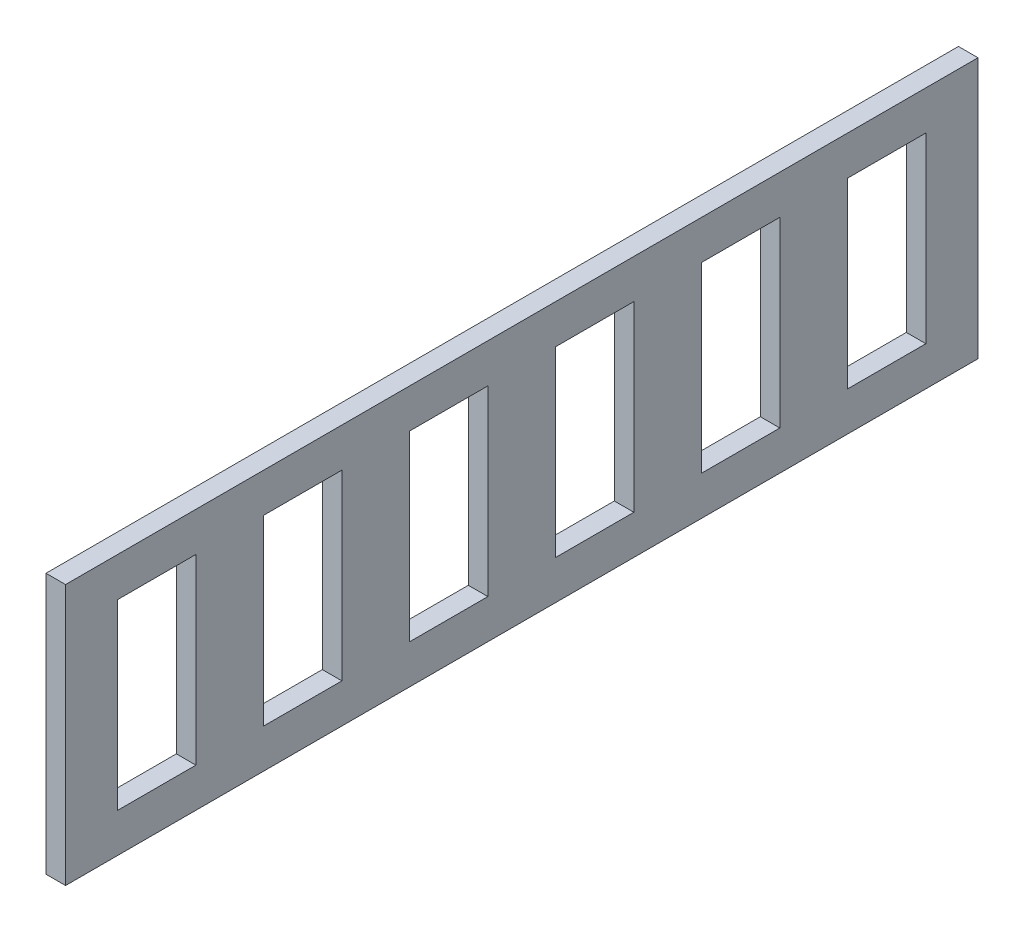
ISO-10303-21;
HEADER;
FILE_DESCRIPTION(('STEP AP214'),'2;1');
FILE_NAME('part.step','',(''),(''),'','','');
FILE_SCHEMA(('AUTOMOTIVE_DESIGN { 1 0 10303 214 1 1 1 1 }'));
ENDSEC;
DATA;
#1=APPLICATION_CONTEXT('core data for automotive mechanical design processes');
#2=APPLICATION_PROTOCOL_DEFINITION('international standard','automotive_design',2000,#1);
#3=PRODUCT_CONTEXT('',#1,'mechanical');
#4=PRODUCT('Part','Part','',(#3));
#5=PRODUCT_RELATED_PRODUCT_CATEGORY('part','',(#4));
#6=PRODUCT_DEFINITION_FORMATION('','',#4);
#7=PRODUCT_DEFINITION_CONTEXT('part definition',#1,'design');
#8=PRODUCT_DEFINITION('design','',#6,#7);
#9=PRODUCT_DEFINITION_SHAPE('','',#8);
#10=(LENGTH_UNIT() NAMED_UNIT(*) SI_UNIT(.MILLI.,.METRE.));
#11=(NAMED_UNIT(*) PLANE_ANGLE_UNIT() SI_UNIT($,.RADIAN.));
#12=(NAMED_UNIT(*) SI_UNIT($,.STERADIAN.) SOLID_ANGLE_UNIT());
#13=UNCERTAINTY_MEASURE_WITH_UNIT(LENGTH_MEASURE(1.E-05),#10,'distance_accuracy_value','');
#14=(GEOMETRIC_REPRESENTATION_CONTEXT(3) GLOBAL_UNCERTAINTY_ASSIGNED_CONTEXT((#13)) GLOBAL_UNIT_ASSIGNED_CONTEXT((#10,
#11,#12)) REPRESENTATION_CONTEXT('',''));
#15=CARTESIAN_POINT('',(0.,0.,0.));
#16=DIRECTION('',(0.,0.,1.));
#17=DIRECTION('',(1.,0.,0.));
#18=AXIS2_PLACEMENT_3D('',#15,#16,#17);
#19=CARTESIAN_POINT('',(15.,0.,0.));
#20=DIRECTION('',(-1.,0.,0.));
#21=DIRECTION('',(0.,0.,1.));
#22=AXIS2_PLACEMENT_3D('',#19,#20,#21);
#23=PLANE('',#22);
#24=DIRECTION('',(0.,0.,1.));
#25=VECTOR('',#24,1.);
#26=CARTESIAN_POINT('',(15.,170.,-138.));
#27=LINE('',#26,#25);
#28=CARTESIAN_POINT('',(15.,170.,-198.));
#29=VERTEX_POINT('',#28);
#30=CARTESIAN_POINT('',(15.,170.,-138.));
#31=VERTEX_POINT('',#30);
#32=EDGE_CURVE('E273',#29,#31,#27,.T.);
#33=ORIENTED_EDGE('',*,*,#32,.F.);
#34=DIRECTION('',(0.,1.,0.));
#35=VECTOR('',#34,1.);
#36=CARTESIAN_POINT('',(15.,170.,-198.));
#37=LINE('',#36,#35);
#38=CARTESIAN_POINT('',(15.,30.,-198.));
#39=VERTEX_POINT('',#38);
#40=EDGE_CURVE('E284',#39,#29,#37,.T.);
#41=ORIENTED_EDGE('',*,*,#40,.F.);
#42=DIRECTION('',(0.,0.,-1.));
#43=VECTOR('',#42,1.);
#44=CARTESIAN_POINT('',(15.,30.,-138.));
#45=LINE('',#44,#43);
#46=CARTESIAN_POINT('',(15.,30.,-138.));
#47=VERTEX_POINT('',#46);
#48=EDGE_CURVE('E280',#47,#39,#45,.T.);
#49=ORIENTED_EDGE('',*,*,#48,.F.);
#50=DIRECTION('',(0.,-1.,0.));
#51=VECTOR('',#50,1.);
#52=CARTESIAN_POINT('',(15.,170.,-138.));
#53=LINE('',#52,#51);
#54=EDGE_CURVE('E276',#31,#47,#53,.T.);
#55=ORIENTED_EDGE('',*,*,#54,.F.);
#56=EDGE_LOOP('',(#33,#41,#49,#55));
#57=FACE_BOUND('',#56,.T.);
#58=DIRECTION('',(0.,0.,1.));
#59=VECTOR('',#58,1.);
#60=CARTESIAN_POINT('',(15.,170.,86.));
#61=LINE('',#60,#59);
#62=CARTESIAN_POINT('',(15.,170.,26.));
#63=VERTEX_POINT('',#62);
#64=CARTESIAN_POINT('',(15.,170.,86.));
#65=VERTEX_POINT('',#64);
#66=EDGE_CURVE('E359',#63,#65,#61,.T.);
#67=ORIENTED_EDGE('',*,*,#66,.F.);
#68=DIRECTION('',(0.,1.,0.));
#69=VECTOR('',#68,1.);
#70=CARTESIAN_POINT('',(15.,170.,26.));
#71=LINE('',#70,#69);
#72=CARTESIAN_POINT('',(15.,30.,26.));
#73=VERTEX_POINT('',#72);
#74=EDGE_CURVE('E370',#73,#63,#71,.T.);
#75=ORIENTED_EDGE('',*,*,#74,.F.);
#76=DIRECTION('',(0.,0.,-1.));
#77=VECTOR('',#76,1.);
#78=CARTESIAN_POINT('',(15.,30.,86.));
#79=LINE('',#78,#77);
#80=CARTESIAN_POINT('',(15.,30.,86.));
#81=VERTEX_POINT('',#80);
#82=EDGE_CURVE('E366',#81,#73,#79,.T.);
#83=ORIENTED_EDGE('',*,*,#82,.F.);
#84=DIRECTION('',(0.,-1.,0.));
#85=VECTOR('',#84,1.);
#86=CARTESIAN_POINT('',(15.,170.,86.));
#87=LINE('',#86,#85);
#88=EDGE_CURVE('E362',#65,#81,#87,.T.);
#89=ORIENTED_EDGE('',*,*,#88,.F.);
#90=EDGE_LOOP('',(#67,#75,#83,#89));
#91=FACE_BOUND('',#90,.T.);
#92=DIRECTION('',(0.,-1.,0.));
#93=VECTOR('',#92,1.);
#94=CARTESIAN_POINT('',(15.,170.,310.));
#95=LINE('',#94,#93);
#96=CARTESIAN_POINT('',(15.,170.,310.));
#97=VERTEX_POINT('',#96);
#98=CARTESIAN_POINT('',(15.,30.,310.));
#99=VERTEX_POINT('',#98);
#100=EDGE_CURVE('E445',#97,#99,#95,.T.);
#101=ORIENTED_EDGE('',*,*,#100,.F.);
#102=DIRECTION('',(0.,0.,1.));
#103=VECTOR('',#102,1.);
#104=CARTESIAN_POINT('',(15.,170.,310.));
#105=LINE('',#104,#103);
#106=CARTESIAN_POINT('',(15.,170.,250.));
#107=VERTEX_POINT('',#106);
#108=EDGE_CURVE('E456',#107,#97,#105,.T.);
#109=ORIENTED_EDGE('',*,*,#108,.F.);
#110=DIRECTION('',(0.,1.,0.));
#111=VECTOR('',#110,1.);
#112=CARTESIAN_POINT('',(15.,170.,250.));
#113=LINE('',#112,#111);
#114=CARTESIAN_POINT('',(15.,30.,250.));
#115=VERTEX_POINT('',#114);
#116=EDGE_CURVE('E452',#115,#107,#113,.T.);
#117=ORIENTED_EDGE('',*,*,#116,.F.);
#118=DIRECTION('',(0.,0.,-1.));
#119=VECTOR('',#118,1.);
#120=CARTESIAN_POINT('',(15.,30.,310.));
#121=LINE('',#120,#119);
#122=EDGE_CURVE('E448',#99,#115,#121,.T.);
#123=ORIENTED_EDGE('',*,*,#122,.F.);
#124=EDGE_LOOP('',(#101,#109,#117,#123));
#125=FACE_BOUND('',#124,.T.);
#126=DIRECTION('',(0.,-1.,0.));
#127=VECTOR('',#126,1.);
#128=CARTESIAN_POINT('',(15.,0.,350.));
#129=LINE('',#128,#127);
#130=CARTESIAN_POINT('',(15.,200.,350.));
#131=VERTEX_POINT('',#130);
#132=CARTESIAN_POINT('',(15.,0.,350.));
#133=VERTEX_POINT('',#132);
#134=EDGE_CURVE('E488',#131,#133,#129,.T.);
#135=ORIENTED_EDGE('',*,*,#134,.T.);
#136=DIRECTION('',(0.,0.,-1.));
#137=VECTOR('',#136,1.);
#138=CARTESIAN_POINT('',(15.,0.,350.));
#139=LINE('',#138,#137);
#140=CARTESIAN_POINT('',(15.,0.,-350.));
#141=VERTEX_POINT('',#140);
#142=EDGE_CURVE('E492',#133,#141,#139,.T.);
#143=ORIENTED_EDGE('',*,*,#142,.T.);
#144=DIRECTION('',(0.,1.,0.));
#145=VECTOR('',#144,1.);
#146=CARTESIAN_POINT('',(15.,0.,-350.));
#147=LINE('',#146,#145);
#148=CARTESIAN_POINT('',(15.,200.,-350.));
#149=VERTEX_POINT('',#148);
#150=EDGE_CURVE('E496',#141,#149,#147,.T.);
#151=ORIENTED_EDGE('',*,*,#150,.T.);
#152=DIRECTION('',(0.,0.,1.));
#153=VECTOR('',#152,1.);
#154=CARTESIAN_POINT('',(15.,200.,350.));
#155=LINE('',#154,#153);
#156=EDGE_CURVE('E499',#149,#131,#155,.T.);
#157=ORIENTED_EDGE('',*,*,#156,.T.);
#158=EDGE_LOOP('',(#135,#143,#151,#157));
#159=FACE_BOUND('',#158,.T.);
#160=DIRECTION('',(0.,0.,1.));
#161=VECTOR('',#160,1.);
#162=CARTESIAN_POINT('',(15.,170.,198.));
#163=LINE('',#162,#161);
#164=CARTESIAN_POINT('',(15.,170.,138.));
#165=VERTEX_POINT('',#164);
#166=CARTESIAN_POINT('',(15.,170.,198.));
#167=VERTEX_POINT('',#166);
#168=EDGE_CURVE('E402',#165,#167,#163,.T.);
#169=ORIENTED_EDGE('',*,*,#168,.F.);
#170=DIRECTION('',(0.,1.,0.));
#171=VECTOR('',#170,1.);
#172=CARTESIAN_POINT('',(15.,170.,138.));
#173=LINE('',#172,#171);
#174=CARTESIAN_POINT('',(15.,30.,138.));
#175=VERTEX_POINT('',#174);
#176=EDGE_CURVE('E413',#175,#165,#173,.T.);
#177=ORIENTED_EDGE('',*,*,#176,.F.);
#178=DIRECTION('',(0.,0.,-1.));
#179=VECTOR('',#178,1.);
#180=CARTESIAN_POINT('',(15.,30.,198.));
#181=LINE('',#180,#179);
#182=CARTESIAN_POINT('',(15.,30.,198.));
#183=VERTEX_POINT('',#182);
#184=EDGE_CURVE('E409',#183,#175,#181,.T.);
#185=ORIENTED_EDGE('',*,*,#184,.F.);
#186=DIRECTION('',(0.,-1.,0.));
#187=VECTOR('',#186,1.);
#188=CARTESIAN_POINT('',(15.,170.,198.));
#189=LINE('',#188,#187);
#190=EDGE_CURVE('E405',#167,#183,#189,.T.);
#191=ORIENTED_EDGE('',*,*,#190,.F.);
#192=EDGE_LOOP('',(#169,#177,#185,#191));
#193=FACE_BOUND('',#192,.T.);
#194=DIRECTION('',(0.,0.,1.));
#195=VECTOR('',#194,1.);
#196=CARTESIAN_POINT('',(15.,170.,-26.));
#197=LINE('',#196,#195);
#198=CARTESIAN_POINT('',(15.,170.,-86.0000000000001));
#199=VERTEX_POINT('',#198);
#200=CARTESIAN_POINT('',(15.,170.,-26.));
#201=VERTEX_POINT('',#200);
#202=EDGE_CURVE('E316',#199,#201,#197,.T.);
#203=ORIENTED_EDGE('',*,*,#202,.F.);
#204=DIRECTION('',(0.,1.,0.));
#205=VECTOR('',#204,1.);
#206=CARTESIAN_POINT('',(15.,170.,-86.0000000000001));
#207=LINE('',#206,#205);
#208=CARTESIAN_POINT('',(15.,30.,-86.0000000000001));
#209=VERTEX_POINT('',#208);
#210=EDGE_CURVE('E327',#209,#199,#207,.T.);
#211=ORIENTED_EDGE('',*,*,#210,.F.);
#212=DIRECTION('',(0.,0.,-1.));
#213=VECTOR('',#212,1.);
#214=CARTESIAN_POINT('',(15.,30.,-26.0000000000001));
#215=LINE('',#214,#213);
#216=CARTESIAN_POINT('',(15.,30.,-26.0000000000001));
#217=VERTEX_POINT('',#216);
#218=EDGE_CURVE('E323',#217,#209,#215,.T.);
#219=ORIENTED_EDGE('',*,*,#218,.F.);
#220=DIRECTION('',(0.,-1.,0.));
#221=VECTOR('',#220,1.);
#222=CARTESIAN_POINT('',(15.,170.,-26.));
#223=LINE('',#222,#221);
#224=EDGE_CURVE('E319',#201,#217,#223,.T.);
#225=ORIENTED_EDGE('',*,*,#224,.F.);
#226=EDGE_LOOP('',(#203,#211,#219,#225));
#227=FACE_BOUND('',#226,.T.);
#228=DIRECTION('',(0.,0.,1.));
#229=VECTOR('',#228,1.);
#230=CARTESIAN_POINT('',(15.,170.,-250.));
#231=LINE('',#230,#229);
#232=CARTESIAN_POINT('',(15.,170.,-310.));
#233=VERTEX_POINT('',#232);
#234=CARTESIAN_POINT('',(15.,170.,-250.));
#235=VERTEX_POINT('',#234);
#236=EDGE_CURVE('E225',#233,#235,#231,.T.);
#237=ORIENTED_EDGE('',*,*,#236,.F.);
#238=DIRECTION('',(0.,1.,0.));
#239=VECTOR('',#238,1.);
#240=CARTESIAN_POINT('',(15.,170.,-310.));
#241=LINE('',#240,#239);
#242=CARTESIAN_POINT('',(15.,30.,-310.));
#243=VERTEX_POINT('',#242);
#244=EDGE_CURVE('E251',#243,#233,#241,.T.);
#245=ORIENTED_EDGE('',*,*,#244,.F.);
#246=DIRECTION('',(0.,0.,-1.));
#247=VECTOR('',#246,1.);
#248=CARTESIAN_POINT('',(15.,30.,-250.));
#249=LINE('',#248,#247);
#250=CARTESIAN_POINT('',(15.,30.,-250.));
#251=VERTEX_POINT('',#250);
#252=EDGE_CURVE('E247',#251,#243,#249,.T.);
#253=ORIENTED_EDGE('',*,*,#252,.F.);
#254=DIRECTION('',(0.,-1.,0.));
#255=VECTOR('',#254,1.);
#256=CARTESIAN_POINT('',(15.,170.,-250.));
#257=LINE('',#256,#255);
#258=EDGE_CURVE('E234',#235,#251,#257,.T.);
#259=ORIENTED_EDGE('',*,*,#258,.F.);
#260=EDGE_LOOP('',(#237,#245,#253,#259));
#261=FACE_BOUND('',#260,.T.);
#262=ADVANCED_FACE('F39',(#57,#91,#125,#159,#193,#227,#261),#23,.F.);
#263=CARTESIAN_POINT('',(0.,0.,0.));
#264=DIRECTION('',(-1.,0.,0.));
#265=DIRECTION('',(0.,0.,1.));
#266=AXIS2_PLACEMENT_3D('',#263,#264,#265);
#267=PLANE('',#266);
#268=DIRECTION('',(0.,-1.,0.));
#269=VECTOR('',#268,1.);
#270=CARTESIAN_POINT('',(0.,0.,350.));
#271=LINE('',#270,#269);
#272=CARTESIAN_POINT('',(0.,200.,350.));
#273=VERTEX_POINT('',#272);
#274=CARTESIAN_POINT('',(0.,0.,350.));
#275=VERTEX_POINT('',#274);
#276=EDGE_CURVE('E487',#273,#275,#271,.T.);
#277=ORIENTED_EDGE('',*,*,#276,.F.);
#278=DIRECTION('',(0.,0.,1.));
#279=VECTOR('',#278,1.);
#280=CARTESIAN_POINT('',(0.,200.,350.));
#281=LINE('',#280,#279);
#282=CARTESIAN_POINT('',(0.,200.,-350.));
#283=VERTEX_POINT('',#282);
#284=EDGE_CURVE('E493',#283,#273,#281,.T.);
#285=ORIENTED_EDGE('',*,*,#284,.F.);
#286=DIRECTION('',(0.,1.,0.));
#287=VECTOR('',#286,1.);
#288=CARTESIAN_POINT('',(0.,0.,-350.));
#289=LINE('',#288,#287);
#290=CARTESIAN_POINT('',(0.,0.,-350.));
#291=VERTEX_POINT('',#290);
#292=EDGE_CURVE('E509',#291,#283,#289,.T.);
#293=ORIENTED_EDGE('',*,*,#292,.F.);
#294=DIRECTION('',(0.,0.,-1.));
#295=VECTOR('',#294,1.);
#296=CARTESIAN_POINT('',(0.,0.,350.));
#297=LINE('',#296,#295);
#298=EDGE_CURVE('E506',#275,#291,#297,.T.);
#299=ORIENTED_EDGE('',*,*,#298,.F.);
#300=EDGE_LOOP('',(#277,#285,#293,#299));
#301=FACE_BOUND('',#300,.T.);
#302=DIRECTION('',(0.,0.,1.));
#303=VECTOR('',#302,1.);
#304=CARTESIAN_POINT('',(0.,170.,310.));
#305=LINE('',#304,#303);
#306=CARTESIAN_POINT('',(0.,170.,250.));
#307=VERTEX_POINT('',#306);
#308=CARTESIAN_POINT('',(0.,170.,310.));
#309=VERTEX_POINT('',#308);
#310=EDGE_CURVE('E449',#307,#309,#305,.T.);
#311=ORIENTED_EDGE('',*,*,#310,.T.);
#312=DIRECTION('',(0.,-1.,0.));
#313=VECTOR('',#312,1.);
#314=CARTESIAN_POINT('',(0.,170.,310.));
#315=LINE('',#314,#313);
#316=CARTESIAN_POINT('',(0.,30.,310.));
#317=VERTEX_POINT('',#316);
#318=EDGE_CURVE('E444',#309,#317,#315,.T.);
#319=ORIENTED_EDGE('',*,*,#318,.T.);
#320=DIRECTION('',(0.,0.,-1.));
#321=VECTOR('',#320,1.);
#322=CARTESIAN_POINT('',(0.,30.,310.));
#323=LINE('',#322,#321);
#324=CARTESIAN_POINT('',(0.,30.,250.));
#325=VERTEX_POINT('',#324);
#326=EDGE_CURVE('E463',#317,#325,#323,.T.);
#327=ORIENTED_EDGE('',*,*,#326,.T.);
#328=DIRECTION('',(0.,1.,0.));
#329=VECTOR('',#328,1.);
#330=CARTESIAN_POINT('',(0.,170.,250.));
#331=LINE('',#330,#329);
#332=EDGE_CURVE('E467',#325,#307,#331,.T.);
#333=ORIENTED_EDGE('',*,*,#332,.T.);
#334=EDGE_LOOP('',(#311,#319,#327,#333));
#335=FACE_BOUND('',#334,.T.);
#336=DIRECTION('',(0.,1.,0.));
#337=VECTOR('',#336,1.);
#338=CARTESIAN_POINT('',(0.,170.,138.));
#339=LINE('',#338,#337);
#340=CARTESIAN_POINT('',(0.,30.,138.));
#341=VERTEX_POINT('',#340);
#342=CARTESIAN_POINT('',(0.,170.,138.));
#343=VERTEX_POINT('',#342);
#344=EDGE_CURVE('E406',#341,#343,#339,.T.);
#345=ORIENTED_EDGE('',*,*,#344,.T.);
#346=DIRECTION('',(0.,0.,1.));
#347=VECTOR('',#346,1.);
#348=CARTESIAN_POINT('',(0.,170.,198.));
#349=LINE('',#348,#347);
#350=CARTESIAN_POINT('',(0.,170.,198.));
#351=VERTEX_POINT('',#350);
#352=EDGE_CURVE('E401',#343,#351,#349,.T.);
#353=ORIENTED_EDGE('',*,*,#352,.T.);
#354=DIRECTION('',(0.,-1.,0.));
#355=VECTOR('',#354,1.);
#356=CARTESIAN_POINT('',(0.,170.,198.));
#357=LINE('',#356,#355);
#358=CARTESIAN_POINT('',(0.,30.,198.));
#359=VERTEX_POINT('',#358);
#360=EDGE_CURVE('E420',#351,#359,#357,.T.);
#361=ORIENTED_EDGE('',*,*,#360,.T.);
#362=DIRECTION('',(0.,0.,-1.));
#363=VECTOR('',#362,1.);
#364=CARTESIAN_POINT('',(0.,30.,198.));
#365=LINE('',#364,#363);
#366=EDGE_CURVE('E424',#359,#341,#365,.T.);
#367=ORIENTED_EDGE('',*,*,#366,.T.);
#368=EDGE_LOOP('',(#345,#353,#361,#367));
#369=FACE_BOUND('',#368,.T.);
#370=DIRECTION('',(0.,1.,0.));
#371=VECTOR('',#370,1.);
#372=CARTESIAN_POINT('',(0.,170.,26.));
#373=LINE('',#372,#371);
#374=CARTESIAN_POINT('',(0.,30.,26.));
#375=VERTEX_POINT('',#374);
#376=CARTESIAN_POINT('',(0.,170.,26.));
#377=VERTEX_POINT('',#376);
#378=EDGE_CURVE('E363',#375,#377,#373,.T.);
#379=ORIENTED_EDGE('',*,*,#378,.T.);
#380=DIRECTION('',(0.,0.,1.));
#381=VECTOR('',#380,1.);
#382=CARTESIAN_POINT('',(0.,170.,86.));
#383=LINE('',#382,#381);
#384=CARTESIAN_POINT('',(0.,170.,86.));
#385=VERTEX_POINT('',#384);
#386=EDGE_CURVE('E358',#377,#385,#383,.T.);
#387=ORIENTED_EDGE('',*,*,#386,.T.);
#388=DIRECTION('',(0.,-1.,0.));
#389=VECTOR('',#388,1.);
#390=CARTESIAN_POINT('',(0.,170.,86.));
#391=LINE('',#390,#389);
#392=CARTESIAN_POINT('',(0.,30.,86.));
#393=VERTEX_POINT('',#392);
#394=EDGE_CURVE('E377',#385,#393,#391,.T.);
#395=ORIENTED_EDGE('',*,*,#394,.T.);
#396=DIRECTION('',(0.,0.,-1.));
#397=VECTOR('',#396,1.);
#398=CARTESIAN_POINT('',(0.,30.,86.));
#399=LINE('',#398,#397);
#400=EDGE_CURVE('E381',#393,#375,#399,.T.);
#401=ORIENTED_EDGE('',*,*,#400,.T.);
#402=EDGE_LOOP('',(#379,#387,#395,#401));
#403=FACE_BOUND('',#402,.T.);
#404=DIRECTION('',(0.,1.,0.));
#405=VECTOR('',#404,1.);
#406=CARTESIAN_POINT('',(0.,170.,-86.0000000000001));
#407=LINE('',#406,#405);
#408=CARTESIAN_POINT('',(0.,30.,-86.0000000000001));
#409=VERTEX_POINT('',#408);
#410=CARTESIAN_POINT('',(0.,170.,-86.0000000000001));
#411=VERTEX_POINT('',#410);
#412=EDGE_CURVE('E320',#409,#411,#407,.T.);
#413=ORIENTED_EDGE('',*,*,#412,.T.);
#414=DIRECTION('',(0.,0.,1.));
#415=VECTOR('',#414,1.);
#416=CARTESIAN_POINT('',(0.,170.,-26.));
#417=LINE('',#416,#415);
#418=CARTESIAN_POINT('',(0.,170.,-26.));
#419=VERTEX_POINT('',#418);
#420=EDGE_CURVE('E315',#411,#419,#417,.T.);
#421=ORIENTED_EDGE('',*,*,#420,.T.);
#422=DIRECTION('',(0.,-1.,0.));
#423=VECTOR('',#422,1.);
#424=CARTESIAN_POINT('',(0.,170.,-26.));
#425=LINE('',#424,#423);
#426=CARTESIAN_POINT('',(0.,30.,-26.0000000000001));
#427=VERTEX_POINT('',#426);
#428=EDGE_CURVE('E334',#419,#427,#425,.T.);
#429=ORIENTED_EDGE('',*,*,#428,.T.);
#430=DIRECTION('',(0.,0.,-1.));
#431=VECTOR('',#430,1.);
#432=CARTESIAN_POINT('',(0.,30.,-26.0000000000001));
#433=LINE('',#432,#431);
#434=EDGE_CURVE('E338',#427,#409,#433,.T.);
#435=ORIENTED_EDGE('',*,*,#434,.T.);
#436=EDGE_LOOP('',(#413,#421,#429,#435));
#437=FACE_BOUND('',#436,.T.);
#438=DIRECTION('',(0.,1.,0.));
#439=VECTOR('',#438,1.);
#440=CARTESIAN_POINT('',(0.,170.,-198.));
#441=LINE('',#440,#439);
#442=CARTESIAN_POINT('',(0.,30.,-198.));
#443=VERTEX_POINT('',#442);
#444=CARTESIAN_POINT('',(0.,170.,-198.));
#445=VERTEX_POINT('',#444);
#446=EDGE_CURVE('E277',#443,#445,#441,.T.);
#447=ORIENTED_EDGE('',*,*,#446,.T.);
#448=DIRECTION('',(0.,0.,1.));
#449=VECTOR('',#448,1.);
#450=CARTESIAN_POINT('',(0.,170.,-138.));
#451=LINE('',#450,#449);
#452=CARTESIAN_POINT('',(0.,170.,-138.));
#453=VERTEX_POINT('',#452);
#454=EDGE_CURVE('E243',#445,#453,#451,.T.);
#455=ORIENTED_EDGE('',*,*,#454,.T.);
#456=DIRECTION('',(0.,-1.,0.));
#457=VECTOR('',#456,1.);
#458=CARTESIAN_POINT('',(0.,170.,-138.));
#459=LINE('',#458,#457);
#460=CARTESIAN_POINT('',(0.,30.,-138.));
#461=VERTEX_POINT('',#460);
#462=EDGE_CURVE('E291',#453,#461,#459,.T.);
#463=ORIENTED_EDGE('',*,*,#462,.T.);
#464=DIRECTION('',(0.,0.,-1.));
#465=VECTOR('',#464,1.);
#466=CARTESIAN_POINT('',(0.,30.,-138.));
#467=LINE('',#466,#465);
#468=EDGE_CURVE('E295',#461,#443,#467,.T.);
#469=ORIENTED_EDGE('',*,*,#468,.T.);
#470=EDGE_LOOP('',(#447,#455,#463,#469));
#471=FACE_BOUND('',#470,.T.);
#472=DIRECTION('',(0.,1.,0.));
#473=VECTOR('',#472,1.);
#474=CARTESIAN_POINT('',(0.,170.,-310.));
#475=LINE('',#474,#473);
#476=CARTESIAN_POINT('',(0.,30.,-310.));
#477=VERTEX_POINT('',#476);
#478=CARTESIAN_POINT('',(0.,170.,-310.));
#479=VERTEX_POINT('',#478);
#480=EDGE_CURVE('E235',#477,#479,#475,.T.);
#481=ORIENTED_EDGE('',*,*,#480,.T.);
#482=DIRECTION('',(0.,0.,1.));
#483=VECTOR('',#482,1.);
#484=CARTESIAN_POINT('',(0.,170.,-250.));
#485=LINE('',#484,#483);
#486=CARTESIAN_POINT('',(0.,170.,-250.));
#487=VERTEX_POINT('',#486);
#488=EDGE_CURVE('E63',#479,#487,#485,.T.);
#489=ORIENTED_EDGE('',*,*,#488,.T.);
#490=DIRECTION('',(0.,-1.,0.));
#491=VECTOR('',#490,1.);
#492=CARTESIAN_POINT('',(0.,170.,-250.));
#493=LINE('',#492,#491);
#494=CARTESIAN_POINT('',(0.,30.,-250.));
#495=VERTEX_POINT('',#494);
#496=EDGE_CURVE('E241',#487,#495,#493,.T.);
#497=ORIENTED_EDGE('',*,*,#496,.T.);
#498=DIRECTION('',(0.,0.,-1.));
#499=VECTOR('',#498,1.);
#500=CARTESIAN_POINT('',(0.,30.,-250.));
#501=LINE('',#500,#499);
#502=EDGE_CURVE('E260',#495,#477,#501,.T.);
#503=ORIENTED_EDGE('',*,*,#502,.T.);
#504=EDGE_LOOP('',(#481,#489,#497,#503));
#505=FACE_BOUND('',#504,.T.);
#506=ADVANCED_FACE('F532',(#301,#335,#369,#403,#437,#471,#505),#267,.T.);
#507=CARTESIAN_POINT('',(15.,0.,350.));
#508=DIRECTION('',(0.,0.,-1.));
#509=DIRECTION('',(-1.,0.,0.));
#510=AXIS2_PLACEMENT_3D('',#507,#508,#509);
#511=PLANE('',#510);
#512=ORIENTED_EDGE('',*,*,#276,.T.);
#513=DIRECTION('',(-1.,0.,0.));
#514=VECTOR('',#513,1.);
#515=CARTESIAN_POINT('',(15.,0.,350.));
#516=LINE('',#515,#514);
#517=EDGE_CURVE('E11',#133,#275,#516,.T.);
#518=ORIENTED_EDGE('',*,*,#517,.F.);
#519=ORIENTED_EDGE('',*,*,#134,.F.);
#520=DIRECTION('',(-1.,0.,0.));
#521=VECTOR('',#520,1.);
#522=CARTESIAN_POINT('',(15.,200.,350.));
#523=LINE('',#522,#521);
#524=EDGE_CURVE('E502',#131,#273,#523,.T.);
#525=ORIENTED_EDGE('',*,*,#524,.T.);
#526=EDGE_LOOP('',(#512,#518,#519,#525));
#527=FACE_BOUND('',#526,.T.);
#528=ADVANCED_FACE('F41',(#527),#511,.F.);
#529=CARTESIAN_POINT('',(15.,0.,350.));
#530=DIRECTION('',(0.,1.,0.));
#531=DIRECTION('',(0.,0.,1.));
#532=AXIS2_PLACEMENT_3D('',#529,#530,#531);
#533=PLANE('',#532);
#534=ORIENTED_EDGE('',*,*,#298,.T.);
#535=DIRECTION('',(-1.,0.,0.));
#536=VECTOR('',#535,1.);
#537=CARTESIAN_POINT('',(15.,0.,-350.));
#538=LINE('',#537,#536);
#539=EDGE_CURVE('E48',#141,#291,#538,.T.);
#540=ORIENTED_EDGE('',*,*,#539,.F.);
#541=ORIENTED_EDGE('',*,*,#142,.F.);
#542=ORIENTED_EDGE('',*,*,#517,.T.);
#543=EDGE_LOOP('',(#534,#540,#541,#542));
#544=FACE_BOUND('',#543,.T.);
#545=ADVANCED_FACE('F543',(#544),#533,.F.);
#546=CARTESIAN_POINT('',(15.,0.,-350.));
#547=DIRECTION('',(0.,0.,1.));
#548=DIRECTION('',(1.,0.,0.));
#549=AXIS2_PLACEMENT_3D('',#546,#547,#548);
#550=PLANE('',#549);
#551=ORIENTED_EDGE('',*,*,#292,.T.);
#552=DIRECTION('',(-1.,0.,0.));
#553=VECTOR('',#552,1.);
#554=CARTESIAN_POINT('',(15.,200.,-350.));
#555=LINE('',#554,#553);
#556=EDGE_CURVE('E517',#149,#283,#555,.T.);
#557=ORIENTED_EDGE('',*,*,#556,.F.);
#558=ORIENTED_EDGE('',*,*,#150,.F.);
#559=ORIENTED_EDGE('',*,*,#539,.T.);
#560=EDGE_LOOP('',(#551,#557,#558,#559));
#561=FACE_BOUND('',#560,.T.);
#562=ADVANCED_FACE('F526',(#561),#550,.F.);
#563=CARTESIAN_POINT('',(15.,200.,350.));
#564=DIRECTION('',(0.,-1.,0.));
#565=DIRECTION('',(0.,0.,-1.));
#566=AXIS2_PLACEMENT_3D('',#563,#564,#565);
#567=PLANE('',#566);
#568=ORIENTED_EDGE('',*,*,#284,.T.);
#569=ORIENTED_EDGE('',*,*,#524,.F.);
#570=ORIENTED_EDGE('',*,*,#156,.F.);
#571=ORIENTED_EDGE('',*,*,#556,.T.);
#572=EDGE_LOOP('',(#568,#569,#570,#571));
#573=FACE_BOUND('',#572,.T.);
#574=ADVANCED_FACE('F536',(#573),#567,.F.);
#575=CARTESIAN_POINT('',(15.,170.,310.));
#576=DIRECTION('',(0.,0.,-1.));
#577=DIRECTION('',(0.,1.,0.));
#578=AXIS2_PLACEMENT_3D('',#575,#576,#577);
#579=PLANE('',#578);
#580=ORIENTED_EDGE('',*,*,#318,.F.);
#581=DIRECTION('',(-1.,0.,0.));
#582=VECTOR('',#581,1.);
#583=CARTESIAN_POINT('',(15.,170.,310.));
#584=LINE('',#583,#582);
#585=EDGE_CURVE('E459',#97,#309,#584,.T.);
#586=ORIENTED_EDGE('',*,*,#585,.F.);
#587=ORIENTED_EDGE('',*,*,#100,.T.);
#588=DIRECTION('',(-1.,0.,0.));
#589=VECTOR('',#588,1.);
#590=CARTESIAN_POINT('',(15.,30.,310.));
#591=LINE('',#590,#589);
#592=EDGE_CURVE('E483',#99,#317,#591,.T.);
#593=ORIENTED_EDGE('',*,*,#592,.T.);
#594=EDGE_LOOP('',(#580,#586,#587,#593));
#595=FACE_BOUND('',#594,.T.);
#596=ADVANCED_FACE('F560',(#595),#579,.T.);
#597=CARTESIAN_POINT('',(15.,30.,310.));
#598=DIRECTION('',(0.,1.,0.));
#599=DIRECTION('',(0.,0.,1.));
#600=AXIS2_PLACEMENT_3D('',#597,#598,#599);
#601=PLANE('',#600);
#602=ORIENTED_EDGE('',*,*,#326,.F.);
#603=ORIENTED_EDGE('',*,*,#592,.F.);
#604=ORIENTED_EDGE('',*,*,#122,.T.);
#605=DIRECTION('',(-1.,0.,0.));
#606=VECTOR('',#605,1.);
#607=CARTESIAN_POINT('',(15.,30.,250.));
#608=LINE('',#607,#606);
#609=EDGE_CURVE('E480',#115,#325,#608,.T.);
#610=ORIENTED_EDGE('',*,*,#609,.T.);
#611=EDGE_LOOP('',(#602,#603,#604,#610));
#612=FACE_BOUND('',#611,.T.);
#613=ADVANCED_FACE('F567',(#612),#601,.T.);
#614=CARTESIAN_POINT('',(15.,170.,250.));
#615=DIRECTION('',(0.,0.,1.));
#616=DIRECTION('',(1.,0.,0.));
#617=AXIS2_PLACEMENT_3D('',#614,#615,#616);
#618=PLANE('',#617);
#619=ORIENTED_EDGE('',*,*,#332,.F.);
#620=ORIENTED_EDGE('',*,*,#609,.F.);
#621=ORIENTED_EDGE('',*,*,#116,.T.);
#622=DIRECTION('',(-1.,0.,0.));
#623=VECTOR('',#622,1.);
#624=CARTESIAN_POINT('',(15.,170.,250.));
#625=LINE('',#624,#623);
#626=EDGE_CURVE('E477',#107,#307,#625,.T.);
#627=ORIENTED_EDGE('',*,*,#626,.T.);
#628=EDGE_LOOP('',(#619,#620,#621,#627));
#629=FACE_BOUND('',#628,.T.);
#630=ADVANCED_FACE('F572',(#629),#618,.T.);
#631=CARTESIAN_POINT('',(15.,170.,310.));
#632=DIRECTION('',(0.,-1.,0.));
#633=DIRECTION('',(0.,0.,-1.));
#634=AXIS2_PLACEMENT_3D('',#631,#632,#633);
#635=PLANE('',#634);
#636=ORIENTED_EDGE('',*,*,#310,.F.);
#637=ORIENTED_EDGE('',*,*,#626,.F.);
#638=ORIENTED_EDGE('',*,*,#108,.T.);
#639=ORIENTED_EDGE('',*,*,#585,.T.);
#640=EDGE_LOOP('',(#636,#637,#638,#639));
#641=FACE_BOUND('',#640,.T.);
#642=ADVANCED_FACE('F579',(#641),#635,.T.);
#643=CARTESIAN_POINT('',(15.,170.,198.));
#644=DIRECTION('',(0.,-1.,0.));
#645=DIRECTION('',(0.,0.,-1.));
#646=AXIS2_PLACEMENT_3D('',#643,#644,#645);
#647=PLANE('',#646);
#648=ORIENTED_EDGE('',*,*,#352,.F.);
#649=DIRECTION('',(-1.,0.,0.));
#650=VECTOR('',#649,1.);
#651=CARTESIAN_POINT('',(15.,170.,138.));
#652=LINE('',#651,#650);
#653=EDGE_CURVE('E416',#165,#343,#652,.T.);
#654=ORIENTED_EDGE('',*,*,#653,.F.);
#655=ORIENTED_EDGE('',*,*,#168,.T.);
#656=DIRECTION('',(-1.,0.,0.));
#657=VECTOR('',#656,1.);
#658=CARTESIAN_POINT('',(15.,170.,198.));
#659=LINE('',#658,#657);
#660=EDGE_CURVE('E440',#167,#351,#659,.T.);
#661=ORIENTED_EDGE('',*,*,#660,.T.);
#662=EDGE_LOOP('',(#648,#654,#655,#661));
#663=FACE_BOUND('',#662,.T.);
#664=ADVANCED_FACE('F593',(#663),#647,.T.);
#665=CARTESIAN_POINT('',(15.,170.,198.));
#666=DIRECTION('',(0.,0.,-1.));
#667=DIRECTION('',(0.,1.,0.));
#668=AXIS2_PLACEMENT_3D('',#665,#666,#667);
#669=PLANE('',#668);
#670=ORIENTED_EDGE('',*,*,#360,.F.);
#671=ORIENTED_EDGE('',*,*,#660,.F.);
#672=ORIENTED_EDGE('',*,*,#190,.T.);
#673=DIRECTION('',(-1.,0.,0.));
#674=VECTOR('',#673,1.);
#675=CARTESIAN_POINT('',(15.,30.,198.));
#676=LINE('',#675,#674);
#677=EDGE_CURVE('E437',#183,#359,#676,.T.);
#678=ORIENTED_EDGE('',*,*,#677,.T.);
#679=EDGE_LOOP('',(#670,#671,#672,#678));
#680=FACE_BOUND('',#679,.T.);
#681=ADVANCED_FACE('F598',(#680),#669,.T.);
#682=CARTESIAN_POINT('',(15.,30.,198.));
#683=DIRECTION('',(0.,1.,0.));
#684=DIRECTION('',(0.,0.,1.));
#685=AXIS2_PLACEMENT_3D('',#682,#683,#684);
#686=PLANE('',#685);
#687=ORIENTED_EDGE('',*,*,#366,.F.);
#688=ORIENTED_EDGE('',*,*,#677,.F.);
#689=ORIENTED_EDGE('',*,*,#184,.T.);
#690=DIRECTION('',(-1.,0.,0.));
#691=VECTOR('',#690,1.);
#692=CARTESIAN_POINT('',(15.,30.,138.));
#693=LINE('',#692,#691);
#694=EDGE_CURVE('E434',#175,#341,#693,.T.);
#695=ORIENTED_EDGE('',*,*,#694,.T.);
#696=EDGE_LOOP('',(#687,#688,#689,#695));
#697=FACE_BOUND('',#696,.T.);
#698=ADVANCED_FACE('F602',(#697),#686,.T.);
#699=CARTESIAN_POINT('',(15.,170.,138.));
#700=DIRECTION('',(0.,0.,1.));
#701=DIRECTION('',(1.,0.,0.));
#702=AXIS2_PLACEMENT_3D('',#699,#700,#701);
#703=PLANE('',#702);
#704=ORIENTED_EDGE('',*,*,#344,.F.);
#705=ORIENTED_EDGE('',*,*,#694,.F.);
#706=ORIENTED_EDGE('',*,*,#176,.T.);
#707=ORIENTED_EDGE('',*,*,#653,.T.);
#708=EDGE_LOOP('',(#704,#705,#706,#707));
#709=FACE_BOUND('',#708,.T.);
#710=ADVANCED_FACE('F606',(#709),#703,.T.);
#711=CARTESIAN_POINT('',(15.,170.,86.));
#712=DIRECTION('',(0.,-1.,0.));
#713=DIRECTION('',(0.,0.,-1.));
#714=AXIS2_PLACEMENT_3D('',#711,#712,#713);
#715=PLANE('',#714);
#716=ORIENTED_EDGE('',*,*,#386,.F.);
#717=DIRECTION('',(-1.,0.,0.));
#718=VECTOR('',#717,1.);
#719=CARTESIAN_POINT('',(15.,170.,26.));
#720=LINE('',#719,#718);
#721=EDGE_CURVE('E373',#63,#377,#720,.T.);
#722=ORIENTED_EDGE('',*,*,#721,.F.);
#723=ORIENTED_EDGE('',*,*,#66,.T.);
#724=DIRECTION('',(-1.,0.,0.));
#725=VECTOR('',#724,1.);
#726=CARTESIAN_POINT('',(15.,170.,86.));
#727=LINE('',#726,#725);
#728=EDGE_CURVE('E397',#65,#385,#727,.T.);
#729=ORIENTED_EDGE('',*,*,#728,.T.);
#730=EDGE_LOOP('',(#716,#722,#723,#729));
#731=FACE_BOUND('',#730,.T.);
#732=ADVANCED_FACE('F610',(#731),#715,.T.);
#733=CARTESIAN_POINT('',(15.,170.,86.));
#734=DIRECTION('',(0.,0.,-1.));
#735=DIRECTION('',(0.,1.,0.));
#736=AXIS2_PLACEMENT_3D('',#733,#734,#735);
#737=PLANE('',#736);
#738=ORIENTED_EDGE('',*,*,#394,.F.);
#739=ORIENTED_EDGE('',*,*,#728,.F.);
#740=ORIENTED_EDGE('',*,*,#88,.T.);
#741=DIRECTION('',(-1.,0.,0.));
#742=VECTOR('',#741,1.);
#743=CARTESIAN_POINT('',(15.,30.,86.));
#744=LINE('',#743,#742);
#745=EDGE_CURVE('E394',#81,#393,#744,.T.);
#746=ORIENTED_EDGE('',*,*,#745,.T.);
#747=EDGE_LOOP('',(#738,#739,#740,#746));
#748=FACE_BOUND('',#747,.T.);
#749=ADVANCED_FACE('F614',(#748),#737,.T.);
#750=CARTESIAN_POINT('',(15.,30.,86.));
#751=DIRECTION('',(0.,1.,0.));
#752=DIRECTION('',(0.,0.,1.));
#753=AXIS2_PLACEMENT_3D('',#750,#751,#752);
#754=PLANE('',#753);
#755=ORIENTED_EDGE('',*,*,#400,.F.);
#756=ORIENTED_EDGE('',*,*,#745,.F.);
#757=ORIENTED_EDGE('',*,*,#82,.T.);
#758=DIRECTION('',(-1.,0.,0.));
#759=VECTOR('',#758,1.);
#760=CARTESIAN_POINT('',(15.,30.,26.));
#761=LINE('',#760,#759);
#762=EDGE_CURVE('E391',#73,#375,#761,.T.);
#763=ORIENTED_EDGE('',*,*,#762,.T.);
#764=EDGE_LOOP('',(#755,#756,#757,#763));
#765=FACE_BOUND('',#764,.T.);
#766=ADVANCED_FACE('F618',(#765),#754,.T.);
#767=CARTESIAN_POINT('',(15.,170.,26.));
#768=DIRECTION('',(0.,0.,1.));
#769=DIRECTION('',(1.,0.,0.));
#770=AXIS2_PLACEMENT_3D('',#767,#768,#769);
#771=PLANE('',#770);
#772=ORIENTED_EDGE('',*,*,#378,.F.);
#773=ORIENTED_EDGE('',*,*,#762,.F.);
#774=ORIENTED_EDGE('',*,*,#74,.T.);
#775=ORIENTED_EDGE('',*,*,#721,.T.);
#776=EDGE_LOOP('',(#772,#773,#774,#775));
#777=FACE_BOUND('',#776,.T.);
#778=ADVANCED_FACE('F622',(#777),#771,.T.);
#779=CARTESIAN_POINT('',(15.,170.,-26.));
#780=DIRECTION('',(0.,-1.,0.));
#781=DIRECTION('',(0.,0.,-1.));
#782=AXIS2_PLACEMENT_3D('',#779,#780,#781);
#783=PLANE('',#782);
#784=ORIENTED_EDGE('',*,*,#420,.F.);
#785=DIRECTION('',(-1.,0.,0.));
#786=VECTOR('',#785,1.);
#787=CARTESIAN_POINT('',(15.,170.,-86.0000000000001));
#788=LINE('',#787,#786);
#789=EDGE_CURVE('E330',#199,#411,#788,.T.);
#790=ORIENTED_EDGE('',*,*,#789,.F.);
#791=ORIENTED_EDGE('',*,*,#202,.T.);
#792=DIRECTION('',(-1.,0.,0.));
#793=VECTOR('',#792,1.);
#794=CARTESIAN_POINT('',(15.,170.,-26.));
#795=LINE('',#794,#793);
#796=EDGE_CURVE('E354',#201,#419,#795,.T.);
#797=ORIENTED_EDGE('',*,*,#796,.T.);
#798=EDGE_LOOP('',(#784,#790,#791,#797));
#799=FACE_BOUND('',#798,.T.);
#800=ADVANCED_FACE('F626',(#799),#783,.T.);
#801=CARTESIAN_POINT('',(15.,170.,-26.));
#802=DIRECTION('',(0.,0.,-1.));
#803=DIRECTION('',(0.,1.,0.));
#804=AXIS2_PLACEMENT_3D('',#801,#802,#803);
#805=PLANE('',#804);
#806=ORIENTED_EDGE('',*,*,#428,.F.);
#807=ORIENTED_EDGE('',*,*,#796,.F.);
#808=ORIENTED_EDGE('',*,*,#224,.T.);
#809=DIRECTION('',(-1.,0.,0.));
#810=VECTOR('',#809,1.);
#811=CARTESIAN_POINT('',(15.,30.,-26.0000000000001));
#812=LINE('',#811,#810);
#813=EDGE_CURVE('E351',#217,#427,#812,.T.);
#814=ORIENTED_EDGE('',*,*,#813,.T.);
#815=EDGE_LOOP('',(#806,#807,#808,#814));
#816=FACE_BOUND('',#815,.T.);
#817=ADVANCED_FACE('F630',(#816),#805,.T.);
#818=CARTESIAN_POINT('',(15.,30.,-26.0000000000001));
#819=DIRECTION('',(0.,1.,0.));
#820=DIRECTION('',(0.,0.,1.));
#821=AXIS2_PLACEMENT_3D('',#818,#819,#820);
#822=PLANE('',#821);
#823=ORIENTED_EDGE('',*,*,#434,.F.);
#824=ORIENTED_EDGE('',*,*,#813,.F.);
#825=ORIENTED_EDGE('',*,*,#218,.T.);
#826=DIRECTION('',(-1.,0.,0.));
#827=VECTOR('',#826,1.);
#828=CARTESIAN_POINT('',(15.,30.,-86.0000000000001));
#829=LINE('',#828,#827);
#830=EDGE_CURVE('E348',#209,#409,#829,.T.);
#831=ORIENTED_EDGE('',*,*,#830,.T.);
#832=EDGE_LOOP('',(#823,#824,#825,#831));
#833=FACE_BOUND('',#832,.T.);
#834=ADVANCED_FACE('F634',(#833),#822,.T.);
#835=CARTESIAN_POINT('',(15.,170.,-86.0000000000001));
#836=DIRECTION('',(0.,0.,1.));
#837=DIRECTION('',(1.,0.,0.));
#838=AXIS2_PLACEMENT_3D('',#835,#836,#837);
#839=PLANE('',#838);
#840=ORIENTED_EDGE('',*,*,#412,.F.);
#841=ORIENTED_EDGE('',*,*,#830,.F.);
#842=ORIENTED_EDGE('',*,*,#210,.T.);
#843=ORIENTED_EDGE('',*,*,#789,.T.);
#844=EDGE_LOOP('',(#840,#841,#842,#843));
#845=FACE_BOUND('',#844,.T.);
#846=ADVANCED_FACE('F638',(#845),#839,.T.);
#847=CARTESIAN_POINT('',(15.,170.,-138.));
#848=DIRECTION('',(0.,-1.,0.));
#849=DIRECTION('',(0.,0.,-1.));
#850=AXIS2_PLACEMENT_3D('',#847,#848,#849);
#851=PLANE('',#850);
#852=ORIENTED_EDGE('',*,*,#454,.F.);
#853=DIRECTION('',(-1.,0.,0.));
#854=VECTOR('',#853,1.);
#855=CARTESIAN_POINT('',(15.,170.,-198.));
#856=LINE('',#855,#854);
#857=EDGE_CURVE('E287',#29,#445,#856,.T.);
#858=ORIENTED_EDGE('',*,*,#857,.F.);
#859=ORIENTED_EDGE('',*,*,#32,.T.);
#860=DIRECTION('',(-1.,0.,0.));
#861=VECTOR('',#860,1.);
#862=CARTESIAN_POINT('',(15.,170.,-138.));
#863=LINE('',#862,#861);
#864=EDGE_CURVE('E311',#31,#453,#863,.T.);
#865=ORIENTED_EDGE('',*,*,#864,.T.);
#866=EDGE_LOOP('',(#852,#858,#859,#865));
#867=FACE_BOUND('',#866,.T.);
#868=ADVANCED_FACE('F642',(#867),#851,.T.);
#869=CARTESIAN_POINT('',(15.,170.,-138.));
#870=DIRECTION('',(0.,0.,-1.));
#871=DIRECTION('',(0.,1.,0.));
#872=AXIS2_PLACEMENT_3D('',#869,#870,#871);
#873=PLANE('',#872);
#874=ORIENTED_EDGE('',*,*,#462,.F.);
#875=ORIENTED_EDGE('',*,*,#864,.F.);
#876=ORIENTED_EDGE('',*,*,#54,.T.);
#877=DIRECTION('',(-1.,0.,0.));
#878=VECTOR('',#877,1.);
#879=CARTESIAN_POINT('',(15.,30.,-138.));
#880=LINE('',#879,#878);
#881=EDGE_CURVE('E308',#47,#461,#880,.T.);
#882=ORIENTED_EDGE('',*,*,#881,.T.);
#883=EDGE_LOOP('',(#874,#875,#876,#882));
#884=FACE_BOUND('',#883,.T.);
#885=ADVANCED_FACE('F646',(#884),#873,.T.);
#886=CARTESIAN_POINT('',(15.,30.,-138.));
#887=DIRECTION('',(0.,1.,0.));
#888=DIRECTION('',(0.,0.,1.));
#889=AXIS2_PLACEMENT_3D('',#886,#887,#888);
#890=PLANE('',#889);
#891=ORIENTED_EDGE('',*,*,#468,.F.);
#892=ORIENTED_EDGE('',*,*,#881,.F.);
#893=ORIENTED_EDGE('',*,*,#48,.T.);
#894=DIRECTION('',(-1.,0.,0.));
#895=VECTOR('',#894,1.);
#896=CARTESIAN_POINT('',(15.,30.,-198.));
#897=LINE('',#896,#895);
#898=EDGE_CURVE('E305',#39,#443,#897,.T.);
#899=ORIENTED_EDGE('',*,*,#898,.T.);
#900=EDGE_LOOP('',(#891,#892,#893,#899));
#901=FACE_BOUND('',#900,.T.);
#902=ADVANCED_FACE('F650',(#901),#890,.T.);
#903=CARTESIAN_POINT('',(15.,170.,-198.));
#904=DIRECTION('',(0.,0.,1.));
#905=DIRECTION('',(1.,0.,0.));
#906=AXIS2_PLACEMENT_3D('',#903,#904,#905);
#907=PLANE('',#906);
#908=ORIENTED_EDGE('',*,*,#446,.F.);
#909=ORIENTED_EDGE('',*,*,#898,.F.);
#910=ORIENTED_EDGE('',*,*,#40,.T.);
#911=ORIENTED_EDGE('',*,*,#857,.T.);
#912=EDGE_LOOP('',(#908,#909,#910,#911));
#913=FACE_BOUND('',#912,.T.);
#914=ADVANCED_FACE('F654',(#913),#907,.T.);
#915=CARTESIAN_POINT('',(15.,170.,-250.));
#916=DIRECTION('',(0.,-1.,0.));
#917=DIRECTION('',(0.,0.,-1.));
#918=AXIS2_PLACEMENT_3D('',#915,#916,#917);
#919=PLANE('',#918);
#920=ORIENTED_EDGE('',*,*,#488,.F.);
#921=DIRECTION('',(-1.,0.,0.));
#922=VECTOR('',#921,1.);
#923=CARTESIAN_POINT('',(15.,170.,-310.));
#924=LINE('',#923,#922);
#925=EDGE_CURVE('E229',#233,#479,#924,.T.);
#926=ORIENTED_EDGE('',*,*,#925,.F.);
#927=ORIENTED_EDGE('',*,*,#236,.T.);
#928=DIRECTION('',(-1.,0.,0.));
#929=VECTOR('',#928,1.);
#930=CARTESIAN_POINT('',(15.,170.,-250.));
#931=LINE('',#930,#929);
#932=EDGE_CURVE('E228',#235,#487,#931,.T.);
#933=ORIENTED_EDGE('',*,*,#932,.T.);
#934=EDGE_LOOP('',(#920,#926,#927,#933));
#935=FACE_BOUND('',#934,.T.);
#936=ADVANCED_FACE('F227',(#935),#919,.T.);
#937=CARTESIAN_POINT('',(15.,170.,-250.));
#938=DIRECTION('',(0.,0.,-1.));
#939=DIRECTION('',(0.,1.,0.));
#940=AXIS2_PLACEMENT_3D('',#937,#938,#939);
#941=PLANE('',#940);
#942=ORIENTED_EDGE('',*,*,#496,.F.);
#943=ORIENTED_EDGE('',*,*,#932,.F.);
#944=ORIENTED_EDGE('',*,*,#258,.T.);
#945=DIRECTION('',(-1.,0.,0.));
#946=VECTOR('',#945,1.);
#947=CARTESIAN_POINT('',(15.,30.,-250.));
#948=LINE('',#947,#946);
#949=EDGE_CURVE('E244',#251,#495,#948,.T.);
#950=ORIENTED_EDGE('',*,*,#949,.T.);
#951=EDGE_LOOP('',(#942,#943,#944,#950));
#952=FACE_BOUND('',#951,.T.);
#953=ADVANCED_FACE('F238',(#952),#941,.T.);
#954=CARTESIAN_POINT('',(15.,30.,-250.));
#955=DIRECTION('',(0.,1.,0.));
#956=DIRECTION('',(0.,0.,1.));
#957=AXIS2_PLACEMENT_3D('',#954,#955,#956);
#958=PLANE('',#957);
#959=ORIENTED_EDGE('',*,*,#502,.F.);
#960=ORIENTED_EDGE('',*,*,#949,.F.);
#961=ORIENTED_EDGE('',*,*,#252,.T.);
#962=DIRECTION('',(-1.,0.,0.));
#963=VECTOR('',#962,1.);
#964=CARTESIAN_POINT('',(15.,30.,-310.));
#965=LINE('',#964,#963);
#966=EDGE_CURVE('E55',#243,#477,#965,.T.);
#967=ORIENTED_EDGE('',*,*,#966,.T.);
#968=EDGE_LOOP('',(#959,#960,#961,#967));
#969=FACE_BOUND('',#968,.T.);
#970=ADVANCED_FACE('F663',(#969),#958,.T.);
#971=CARTESIAN_POINT('',(15.,170.,-310.));
#972=DIRECTION('',(0.,0.,1.));
#973=DIRECTION('',(1.,0.,0.));
#974=AXIS2_PLACEMENT_3D('',#971,#972,#973);
#975=PLANE('',#974);
#976=ORIENTED_EDGE('',*,*,#480,.F.);
#977=ORIENTED_EDGE('',*,*,#966,.F.);
#978=ORIENTED_EDGE('',*,*,#244,.T.);
#979=ORIENTED_EDGE('',*,*,#925,.T.);
#980=EDGE_LOOP('',(#976,#977,#978,#979));
#981=FACE_BOUND('',#980,.T.);
#982=ADVANCED_FACE('F666',(#981),#975,.T.);
#983=CLOSED_SHELL('',(#262,#506,#528,#545,#562,#574,#596,#613,#630,#642,#664,#681,#698,#710,
#732,#749,#766,#778,#800,#817,#834,#846,#868,#885,#902,#914,#936,#953,#970,#982));
#984=MANIFOLD_SOLID_BREP('B2',#983);
#985=ADVANCED_BREP_SHAPE_REPRESENTATION('',(#18,#984),#14);
#986=SHAPE_DEFINITION_REPRESENTATION(#9,#985);
ENDSEC;
END-ISO-10303-21;
